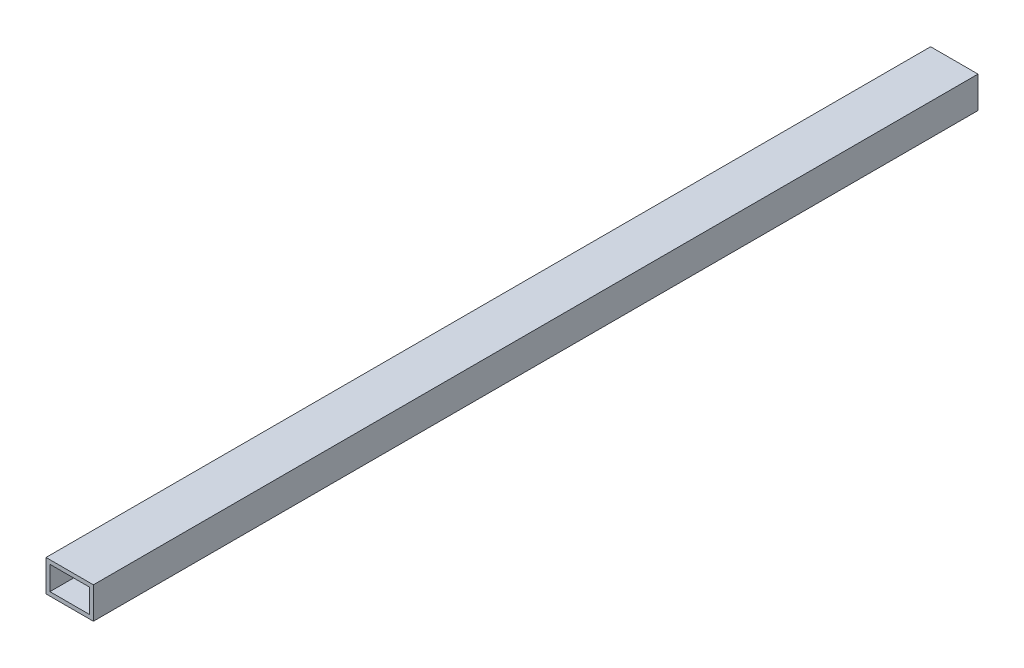
ISO-10303-21;
HEADER;
FILE_DESCRIPTION(('STEP AP214'),'2;1');
FILE_NAME('part.step','',(''),(''),'','','');
FILE_SCHEMA(('AUTOMOTIVE_DESIGN { 1 0 10303 214 1 1 1 1 }'));
ENDSEC;
DATA;
#1=APPLICATION_CONTEXT('core data for automotive mechanical design processes');
#2=APPLICATION_PROTOCOL_DEFINITION('international standard','automotive_design',2000,#1);
#3=PRODUCT_CONTEXT('',#1,'mechanical');
#4=PRODUCT('Part','Part','',(#3));
#5=PRODUCT_RELATED_PRODUCT_CATEGORY('part','',(#4));
#6=PRODUCT_DEFINITION_FORMATION('','',#4);
#7=PRODUCT_DEFINITION_CONTEXT('part definition',#1,'design');
#8=PRODUCT_DEFINITION('design','',#6,#7);
#9=PRODUCT_DEFINITION_SHAPE('','',#8);
#10=(LENGTH_UNIT() NAMED_UNIT(*) SI_UNIT(.MILLI.,.METRE.));
#11=(NAMED_UNIT(*) PLANE_ANGLE_UNIT() SI_UNIT($,.RADIAN.));
#12=(NAMED_UNIT(*) SI_UNIT($,.STERADIAN.) SOLID_ANGLE_UNIT());
#13=UNCERTAINTY_MEASURE_WITH_UNIT(LENGTH_MEASURE(1.E-05),#10,'distance_accuracy_value','');
#14=(GEOMETRIC_REPRESENTATION_CONTEXT(3) GLOBAL_UNCERTAINTY_ASSIGNED_CONTEXT((#13)) GLOBAL_UNIT_ASSIGNED_CONTEXT((#10,
#11,#12)) REPRESENTATION_CONTEXT('',''));
#15=CARTESIAN_POINT('',(0.,0.,0.));
#16=DIRECTION('',(0.,0.,1.));
#17=DIRECTION('',(1.,0.,0.));
#18=AXIS2_PLACEMENT_3D('',#15,#16,#17);
#19=CARTESIAN_POINT('',(0.,0.,355.6));
#20=DIRECTION('',(0.,0.,1.));
#21=DIRECTION('',(1.,0.,0.));
#22=AXIS2_PLACEMENT_3D('',#19,#20,#21);
#23=PLANE('',#22);
#24=DIRECTION('',(0.,-1.,0.));
#25=VECTOR('',#24,1.);
#26=CARTESIAN_POINT('',(-19.05,-12.7,355.6));
#27=LINE('',#26,#25);
#28=CARTESIAN_POINT('',(-19.05,12.7,355.6));
#29=VERTEX_POINT('',#28);
#30=CARTESIAN_POINT('',(-19.05,-12.7,355.6));
#31=VERTEX_POINT('',#30);
#32=EDGE_CURVE('E117',#29,#31,#27,.T.);
#33=ORIENTED_EDGE('',*,*,#32,.T.);
#34=DIRECTION('',(1.,0.,0.));
#35=VECTOR('',#34,1.);
#36=CARTESIAN_POINT('',(19.05,-12.7,355.6));
#37=LINE('',#36,#35);
#38=CARTESIAN_POINT('',(19.05,-12.7,355.6));
#39=VERTEX_POINT('',#38);
#40=EDGE_CURVE('E176',#31,#39,#37,.T.);
#41=ORIENTED_EDGE('',*,*,#40,.T.);
#42=DIRECTION('',(0.,1.,0.));
#43=VECTOR('',#42,1.);
#44=CARTESIAN_POINT('',(19.05,-12.7,355.6));
#45=LINE('',#44,#43);
#46=CARTESIAN_POINT('',(19.05,12.7,355.6));
#47=VERTEX_POINT('',#46);
#48=EDGE_CURVE('E179',#39,#47,#45,.T.);
#49=ORIENTED_EDGE('',*,*,#48,.T.);
#50=DIRECTION('',(-1.,0.,0.));
#51=VECTOR('',#50,1.);
#52=CARTESIAN_POINT('',(19.05,12.7,355.6));
#53=LINE('',#52,#51);
#54=EDGE_CURVE('E63',#47,#29,#53,.T.);
#55=ORIENTED_EDGE('',*,*,#54,.T.);
#56=EDGE_LOOP('',(#33,#41,#49,#55));
#57=FACE_BOUND('',#56,.T.);
#58=DIRECTION('',(1.,0.,0.));
#59=VECTOR('',#58,1.);
#60=CARTESIAN_POINT('',(15.875,-9.525,355.6));
#61=LINE('',#60,#59);
#62=CARTESIAN_POINT('',(-15.875,-9.525,355.6));
#63=VERTEX_POINT('',#62);
#64=CARTESIAN_POINT('',(15.875,-9.525,355.6));
#65=VERTEX_POINT('',#64);
#66=EDGE_CURVE('E158',#63,#65,#61,.T.);
#67=ORIENTED_EDGE('',*,*,#66,.F.);
#68=DIRECTION('',(0.,-1.,0.));
#69=VECTOR('',#68,1.);
#70=CARTESIAN_POINT('',(-15.875,-9.525,355.6));
#71=LINE('',#70,#69);
#72=CARTESIAN_POINT('',(-15.875,9.525,355.6));
#73=VERTEX_POINT('',#72);
#74=EDGE_CURVE('E113',#73,#63,#71,.T.);
#75=ORIENTED_EDGE('',*,*,#74,.F.);
#76=DIRECTION('',(-1.,0.,0.));
#77=VECTOR('',#76,1.);
#78=CARTESIAN_POINT('',(15.875,9.525,355.6));
#79=LINE('',#78,#77);
#80=CARTESIAN_POINT('',(15.875,9.525,355.6));
#81=VERTEX_POINT('',#80);
#82=EDGE_CURVE('E164',#81,#73,#79,.T.);
#83=ORIENTED_EDGE('',*,*,#82,.F.);
#84=DIRECTION('',(0.,1.,0.));
#85=VECTOR('',#84,1.);
#86=CARTESIAN_POINT('',(15.875,-9.525,355.6));
#87=LINE('',#86,#85);
#88=EDGE_CURVE('E161',#65,#81,#87,.T.);
#89=ORIENTED_EDGE('',*,*,#88,.F.);
#90=EDGE_LOOP('',(#67,#75,#83,#89));
#91=FACE_BOUND('',#90,.T.);
#92=ADVANCED_FACE('F39',(#57,#91),#23,.T.);
#93=CARTESIAN_POINT('',(-19.05,-12.7,355.6));
#94=DIRECTION('',(1.,0.,0.));
#95=DIRECTION('',(0.,0.,-1.));
#96=AXIS2_PLACEMENT_3D('',#93,#94,#95);
#97=PLANE('',#96);
#98=DIRECTION('',(0.,0.,-1.));
#99=VECTOR('',#98,1.);
#100=CARTESIAN_POINT('',(-19.05,12.7,355.6));
#101=LINE('',#100,#99);
#102=CARTESIAN_POINT('',(-19.05,12.7,-355.6));
#103=VERTEX_POINT('',#102);
#104=EDGE_CURVE('E184',#29,#103,#101,.T.);
#105=ORIENTED_EDGE('',*,*,#104,.T.);
#106=DIRECTION('',(0.,-1.,0.));
#107=VECTOR('',#106,1.);
#108=CARTESIAN_POINT('',(-19.05,-12.7,-355.6));
#109=LINE('',#108,#107);
#110=CARTESIAN_POINT('',(-19.05,-12.7,-355.6));
#111=VERTEX_POINT('',#110);
#112=EDGE_CURVE('E140',#103,#111,#109,.T.);
#113=ORIENTED_EDGE('',*,*,#112,.T.);
#114=DIRECTION('',(0.,0.,-1.));
#115=VECTOR('',#114,1.);
#116=CARTESIAN_POINT('',(-19.05,-12.7,355.6));
#117=LINE('',#116,#115);
#118=EDGE_CURVE('E11',#31,#111,#117,.T.);
#119=ORIENTED_EDGE('',*,*,#118,.F.);
#120=ORIENTED_EDGE('',*,*,#32,.F.);
#121=EDGE_LOOP('',(#105,#113,#119,#120));
#122=FACE_BOUND('',#121,.T.);
#123=ADVANCED_FACE('F41',(#122),#97,.F.);
#124=CARTESIAN_POINT('',(19.05,-12.7,355.6));
#125=DIRECTION('',(0.,1.,0.));
#126=DIRECTION('',(0.,0.,1.));
#127=AXIS2_PLACEMENT_3D('',#124,#125,#126);
#128=PLANE('',#127);
#129=ORIENTED_EDGE('',*,*,#118,.T.);
#130=DIRECTION('',(1.,0.,0.));
#131=VECTOR('',#130,1.);
#132=CARTESIAN_POINT('',(19.05,-12.7,-355.6));
#133=LINE('',#132,#131);
#134=CARTESIAN_POINT('',(19.05,-12.7,-355.6));
#135=VERTEX_POINT('',#134);
#136=EDGE_CURVE('E144',#111,#135,#133,.T.);
#137=ORIENTED_EDGE('',*,*,#136,.T.);
#138=DIRECTION('',(0.,0.,-1.));
#139=VECTOR('',#138,1.);
#140=CARTESIAN_POINT('',(19.05,-12.7,355.6));
#141=LINE('',#140,#139);
#142=EDGE_CURVE('E48',#39,#135,#141,.T.);
#143=ORIENTED_EDGE('',*,*,#142,.F.);
#144=ORIENTED_EDGE('',*,*,#40,.F.);
#145=EDGE_LOOP('',(#129,#137,#143,#144));
#146=FACE_BOUND('',#145,.T.);
#147=ADVANCED_FACE('F200',(#146),#128,.F.);
#148=CARTESIAN_POINT('',(19.05,-12.7,355.6));
#149=DIRECTION('',(-1.,0.,0.));
#150=DIRECTION('',(0.,-1.,0.));
#151=AXIS2_PLACEMENT_3D('',#148,#149,#150);
#152=PLANE('',#151);
#153=ORIENTED_EDGE('',*,*,#142,.T.);
#154=DIRECTION('',(0.,1.,0.));
#155=VECTOR('',#154,1.);
#156=CARTESIAN_POINT('',(19.05,-12.7,-355.6));
#157=LINE('',#156,#155);
#158=CARTESIAN_POINT('',(19.05,12.7,-355.6));
#159=VERTEX_POINT('',#158);
#160=EDGE_CURVE('E148',#135,#159,#157,.T.);
#161=ORIENTED_EDGE('',*,*,#160,.T.);
#162=DIRECTION('',(0.,0.,-1.));
#163=VECTOR('',#162,1.);
#164=CARTESIAN_POINT('',(19.05,12.7,355.6));
#165=LINE('',#164,#163);
#166=EDGE_CURVE('E187',#47,#159,#165,.T.);
#167=ORIENTED_EDGE('',*,*,#166,.F.);
#168=ORIENTED_EDGE('',*,*,#48,.F.);
#169=EDGE_LOOP('',(#153,#161,#167,#168));
#170=FACE_BOUND('',#169,.T.);
#171=ADVANCED_FACE('F194',(#170),#152,.F.);
#172=CARTESIAN_POINT('',(19.05,12.7,355.6));
#173=DIRECTION('',(0.,-1.,0.));
#174=DIRECTION('',(0.,0.,-1.));
#175=AXIS2_PLACEMENT_3D('',#172,#173,#174);
#176=PLANE('',#175);
#177=ORIENTED_EDGE('',*,*,#166,.T.);
#178=DIRECTION('',(-1.,0.,0.));
#179=VECTOR('',#178,1.);
#180=CARTESIAN_POINT('',(19.05,12.7,-355.6));
#181=LINE('',#180,#179);
#182=EDGE_CURVE('E152',#159,#103,#181,.T.);
#183=ORIENTED_EDGE('',*,*,#182,.T.);
#184=ORIENTED_EDGE('',*,*,#104,.F.);
#185=ORIENTED_EDGE('',*,*,#54,.F.);
#186=EDGE_LOOP('',(#177,#183,#184,#185));
#187=FACE_BOUND('',#186,.T.);
#188=ADVANCED_FACE('F205',(#187),#176,.F.);
#189=CARTESIAN_POINT('',(-15.875,-9.525,355.6));
#190=DIRECTION('',(1.,0.,0.));
#191=DIRECTION('',(0.,0.,-1.));
#192=AXIS2_PLACEMENT_3D('',#189,#190,#191);
#193=PLANE('',#192);
#194=DIRECTION('',(0.,0.,-1.));
#195=VECTOR('',#194,1.);
#196=CARTESIAN_POINT('',(-15.875,-9.525,355.6));
#197=LINE('',#196,#195);
#198=CARTESIAN_POINT('',(-15.875,-9.525,-355.6));
#199=VERTEX_POINT('',#198);
#200=EDGE_CURVE('E105',#63,#199,#197,.T.);
#201=ORIENTED_EDGE('',*,*,#200,.T.);
#202=DIRECTION('',(0.,-1.,0.));
#203=VECTOR('',#202,1.);
#204=CARTESIAN_POINT('',(-15.875,-9.525,-355.6));
#205=LINE('',#204,#203);
#206=CARTESIAN_POINT('',(-15.875,9.525,-355.6));
#207=VERTEX_POINT('',#206);
#208=EDGE_CURVE('E110',#207,#199,#205,.T.);
#209=ORIENTED_EDGE('',*,*,#208,.F.);
#210=DIRECTION('',(0.,0.,-1.));
#211=VECTOR('',#210,1.);
#212=CARTESIAN_POINT('',(-15.875,9.525,355.6));
#213=LINE('',#212,#211);
#214=EDGE_CURVE('E167',#73,#207,#213,.T.);
#215=ORIENTED_EDGE('',*,*,#214,.F.);
#216=ORIENTED_EDGE('',*,*,#74,.T.);
#217=EDGE_LOOP('',(#201,#209,#215,#216));
#218=FACE_BOUND('',#217,.T.);
#219=ADVANCED_FACE('F107',(#218),#193,.T.);
#220=CARTESIAN_POINT('',(15.875,-9.525,355.6));
#221=DIRECTION('',(0.,1.,0.));
#222=DIRECTION('',(0.,0.,1.));
#223=AXIS2_PLACEMENT_3D('',#220,#221,#222);
#224=PLANE('',#223);
#225=DIRECTION('',(0.,0.,-1.));
#226=VECTOR('',#225,1.);
#227=CARTESIAN_POINT('',(15.875,-9.525,355.6));
#228=LINE('',#227,#226);
#229=CARTESIAN_POINT('',(15.875,-9.525,-355.6));
#230=VERTEX_POINT('',#229);
#231=EDGE_CURVE('E118',#65,#230,#228,.T.);
#232=ORIENTED_EDGE('',*,*,#231,.T.);
#233=DIRECTION('',(1.,0.,0.));
#234=VECTOR('',#233,1.);
#235=CARTESIAN_POINT('',(15.875,-9.525,-355.6));
#236=LINE('',#235,#234);
#237=EDGE_CURVE('E121',#199,#230,#236,.T.);
#238=ORIENTED_EDGE('',*,*,#237,.F.);
#239=ORIENTED_EDGE('',*,*,#200,.F.);
#240=ORIENTED_EDGE('',*,*,#66,.T.);
#241=EDGE_LOOP('',(#232,#238,#239,#240));
#242=FACE_BOUND('',#241,.T.);
#243=ADVANCED_FACE('F122',(#242),#224,.T.);
#244=CARTESIAN_POINT('',(15.875,-9.525,355.6));
#245=DIRECTION('',(-1.,0.,0.));
#246=DIRECTION('',(0.,0.,1.));
#247=AXIS2_PLACEMENT_3D('',#244,#245,#246);
#248=PLANE('',#247);
#249=DIRECTION('',(0.,0.,-1.));
#250=VECTOR('',#249,1.);
#251=CARTESIAN_POINT('',(15.875,9.525,355.6));
#252=LINE('',#251,#250);
#253=CARTESIAN_POINT('',(15.875,9.525,-355.6));
#254=VERTEX_POINT('',#253);
#255=EDGE_CURVE('E55',#81,#254,#252,.T.);
#256=ORIENTED_EDGE('',*,*,#255,.T.);
#257=DIRECTION('',(0.,1.,0.));
#258=VECTOR('',#257,1.);
#259=CARTESIAN_POINT('',(15.875,-9.525,-355.6));
#260=LINE('',#259,#258);
#261=EDGE_CURVE('E128',#230,#254,#260,.T.);
#262=ORIENTED_EDGE('',*,*,#261,.F.);
#263=ORIENTED_EDGE('',*,*,#231,.F.);
#264=ORIENTED_EDGE('',*,*,#88,.T.);
#265=EDGE_LOOP('',(#256,#262,#263,#264));
#266=FACE_BOUND('',#265,.T.);
#267=ADVANCED_FACE('F223',(#266),#248,.T.);
#268=CARTESIAN_POINT('',(15.875,9.525,355.6));
#269=DIRECTION('',(0.,-1.,0.));
#270=DIRECTION('',(1.,0.,0.));
#271=AXIS2_PLACEMENT_3D('',#268,#269,#270);
#272=PLANE('',#271);
#273=ORIENTED_EDGE('',*,*,#214,.T.);
#274=DIRECTION('',(-1.,0.,0.));
#275=VECTOR('',#274,1.);
#276=CARTESIAN_POINT('',(15.875,9.525,-355.6));
#277=LINE('',#276,#275);
#278=EDGE_CURVE('E132',#254,#207,#277,.T.);
#279=ORIENTED_EDGE('',*,*,#278,.F.);
#280=ORIENTED_EDGE('',*,*,#255,.F.);
#281=ORIENTED_EDGE('',*,*,#82,.T.);
#282=EDGE_LOOP('',(#273,#279,#280,#281));
#283=FACE_BOUND('',#282,.T.);
#284=ADVANCED_FACE('F226',(#283),#272,.T.);
#285=CARTESIAN_POINT('',(0.,0.,-355.6));
#286=DIRECTION('',(0.,0.,1.));
#287=DIRECTION('',(1.,0.,0.));
#288=AXIS2_PLACEMENT_3D('',#285,#286,#287);
#289=PLANE('',#288);
#290=ORIENTED_EDGE('',*,*,#278,.T.);
#291=ORIENTED_EDGE('',*,*,#208,.T.);
#292=ORIENTED_EDGE('',*,*,#237,.T.);
#293=ORIENTED_EDGE('',*,*,#261,.T.);
#294=EDGE_LOOP('',(#290,#291,#292,#293));
#295=FACE_BOUND('',#294,.T.);
#296=ORIENTED_EDGE('',*,*,#112,.F.);
#297=ORIENTED_EDGE('',*,*,#182,.F.);
#298=ORIENTED_EDGE('',*,*,#160,.F.);
#299=ORIENTED_EDGE('',*,*,#136,.F.);
#300=EDGE_LOOP('',(#296,#297,#298,#299));
#301=FACE_BOUND('',#300,.T.);
#302=ADVANCED_FACE('F130',(#295,#301),#289,.F.);
#303=CLOSED_SHELL('',(#92,#123,#147,#171,#188,#219,#243,#267,#284,#302));
#304=MANIFOLD_SOLID_BREP('B2',#303);
#305=ADVANCED_BREP_SHAPE_REPRESENTATION('',(#18,#304),#14);
#306=SHAPE_DEFINITION_REPRESENTATION(#9,#305);
ENDSEC;
END-ISO-10303-21;
